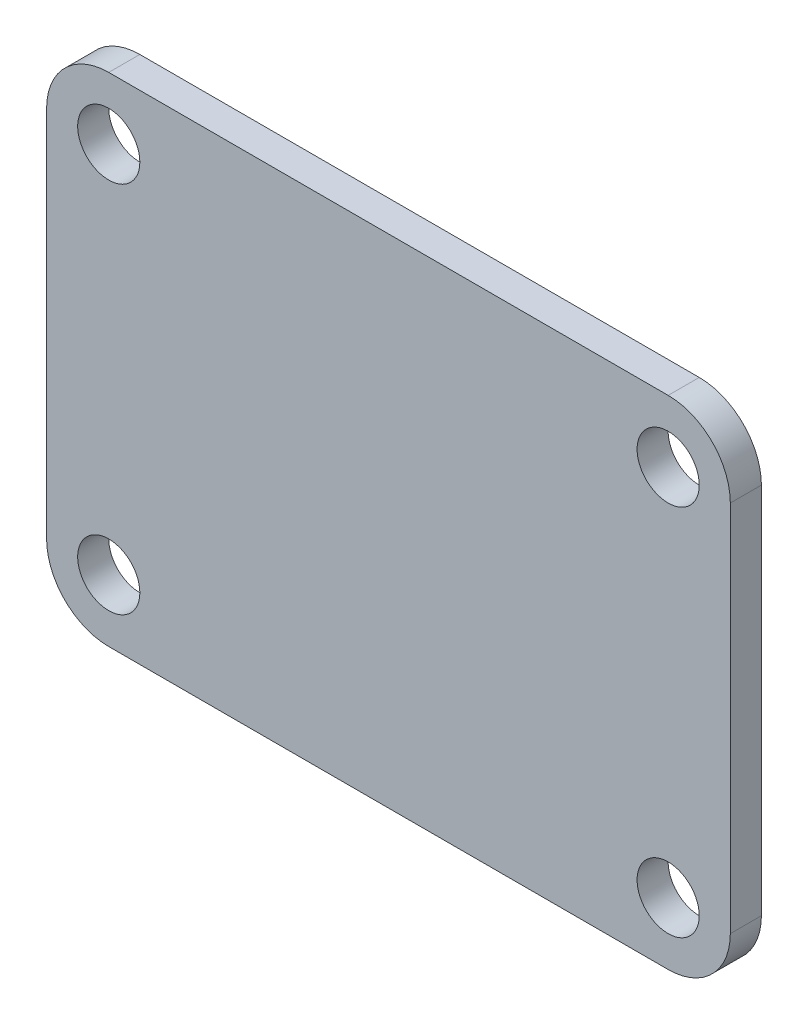
ISO-10303-21;
HEADER;
FILE_DESCRIPTION(('STEP AP214'),'2;1');
FILE_NAME('part.step','',(''),(''),'','','');
FILE_SCHEMA(('AUTOMOTIVE_DESIGN { 1 0 10303 214 1 1 1 1 }'));
ENDSEC;
DATA;
#1=APPLICATION_CONTEXT('core data for automotive mechanical design processes');
#2=APPLICATION_PROTOCOL_DEFINITION('international standard','automotive_design',2000,#1);
#3=PRODUCT_CONTEXT('',#1,'mechanical');
#4=PRODUCT('Part','Part','',(#3));
#5=PRODUCT_RELATED_PRODUCT_CATEGORY('part','',(#4));
#6=PRODUCT_DEFINITION_FORMATION('','',#4);
#7=PRODUCT_DEFINITION_CONTEXT('part definition',#1,'design');
#8=PRODUCT_DEFINITION('design','',#6,#7);
#9=PRODUCT_DEFINITION_SHAPE('','',#8);
#10=(LENGTH_UNIT() NAMED_UNIT(*) SI_UNIT(.MILLI.,.METRE.));
#11=(NAMED_UNIT(*) PLANE_ANGLE_UNIT() SI_UNIT($,.RADIAN.));
#12=(NAMED_UNIT(*) SI_UNIT($,.STERADIAN.) SOLID_ANGLE_UNIT());
#13=UNCERTAINTY_MEASURE_WITH_UNIT(LENGTH_MEASURE(1.E-05),#10,'distance_accuracy_value','');
#14=(GEOMETRIC_REPRESENTATION_CONTEXT(3) GLOBAL_UNCERTAINTY_ASSIGNED_CONTEXT((#13)) GLOBAL_UNIT_ASSIGNED_CONTEXT((#10,
#11,#12)) REPRESENTATION_CONTEXT('',''));
#15=CARTESIAN_POINT('',(0.,0.,0.));
#16=DIRECTION('',(0.,0.,1.));
#17=DIRECTION('',(1.,0.,0.));
#18=AXIS2_PLACEMENT_3D('',#15,#16,#17);
#19=CARTESIAN_POINT('',(0.,0.,1.27));
#20=DIRECTION('',(0.,0.,1.));
#21=DIRECTION('',(1.,0.,0.));
#22=AXIS2_PLACEMENT_3D('',#19,#20,#21);
#23=PLANE('',#22);
#24=CARTESIAN_POINT('',(0.,15.24,1.27));
#25=DIRECTION('',(0.,0.,1.));
#26=DIRECTION('',(1.,0.,0.));
#27=AXIS2_PLACEMENT_3D('',#24,#25,#26);
#28=CIRCLE('',#27,1.27);
#29=CARTESIAN_POINT('',(1.27,15.24,1.27));
#30=VERTEX_POINT('',#29);
#31=EDGE_CURVE('E220',#30,#30,#28,.T.);
#32=ORIENTED_EDGE('',*,*,#31,.F.);
#33=EDGE_LOOP('',(#32));
#34=FACE_BOUND('',#33,.T.);
#35=CARTESIAN_POINT('',(0.,0.,1.27));
#36=DIRECTION('',(0.,0.,1.));
#37=DIRECTION('',(1.,0.,0.));
#38=AXIS2_PLACEMENT_3D('',#35,#36,#37);
#39=CIRCLE('',#38,1.27);
#40=CARTESIAN_POINT('',(1.27,0.,1.27));
#41=VERTEX_POINT('',#40);
#42=EDGE_CURVE('E200',#41,#41,#39,.T.);
#43=ORIENTED_EDGE('',*,*,#42,.F.);
#44=EDGE_LOOP('',(#43));
#45=FACE_BOUND('',#44,.T.);
#46=DIRECTION('',(0.,-1.,0.));
#47=VECTOR('',#46,1.);
#48=CARTESIAN_POINT('',(-2.54,17.78,1.27));
#49=LINE('',#48,#47);
#50=CARTESIAN_POINT('',(-2.54,15.24,1.27));
#51=VERTEX_POINT('',#50);
#52=CARTESIAN_POINT('',(-2.54,0.,1.27));
#53=VERTEX_POINT('',#52);
#54=EDGE_CURVE('E194',#51,#53,#49,.T.);
#55=ORIENTED_EDGE('',*,*,#54,.T.);
#56=CARTESIAN_POINT('',(0.,0.,1.27));
#57=DIRECTION('',(0.,0.,1.));
#58=DIRECTION('',(1.,0.,0.));
#59=AXIS2_PLACEMENT_3D('',#56,#57,#58);
#60=CIRCLE('',#59,2.54);
#61=CARTESIAN_POINT('',(0.,-2.54,1.27));
#62=VERTEX_POINT('',#61);
#63=EDGE_CURVE('E170',#53,#62,#60,.T.);
#64=ORIENTED_EDGE('',*,*,#63,.T.);
#65=DIRECTION('',(1.,0.,0.));
#66=VECTOR('',#65,1.);
#67=CARTESIAN_POINT('',(-2.54,-2.54,1.27));
#68=LINE('',#67,#66);
#69=CARTESIAN_POINT('',(22.86,-2.54,1.27));
#70=VERTEX_POINT('',#69);
#71=EDGE_CURVE('E127',#62,#70,#68,.T.);
#72=ORIENTED_EDGE('',*,*,#71,.T.);
#73=CARTESIAN_POINT('',(22.86,0.,1.27));
#74=DIRECTION('',(0.,0.,1.));
#75=DIRECTION('',(1.,0.,0.));
#76=AXIS2_PLACEMENT_3D('',#73,#74,#75);
#77=CIRCLE('',#76,2.54);
#78=CARTESIAN_POINT('',(25.4,0.,1.27));
#79=VERTEX_POINT('',#78);
#80=EDGE_CURVE('E62',#70,#79,#77,.T.);
#81=ORIENTED_EDGE('',*,*,#80,.T.);
#82=DIRECTION('',(0.,1.,0.));
#83=VECTOR('',#82,1.);
#84=CARTESIAN_POINT('',(25.4,-2.54,1.27));
#85=LINE('',#84,#83);
#86=CARTESIAN_POINT('',(25.4,15.24,1.27));
#87=VERTEX_POINT('',#86);
#88=EDGE_CURVE('E148',#79,#87,#85,.T.);
#89=ORIENTED_EDGE('',*,*,#88,.T.);
#90=CARTESIAN_POINT('',(22.86,15.24,1.27));
#91=DIRECTION('',(0.,0.,1.));
#92=DIRECTION('',(1.,0.,0.));
#93=AXIS2_PLACEMENT_3D('',#90,#91,#92);
#94=CIRCLE('',#93,2.54);
#95=CARTESIAN_POINT('',(22.86,17.78,1.27));
#96=VERTEX_POINT('',#95);
#97=EDGE_CURVE('E165',#87,#96,#94,.T.);
#98=ORIENTED_EDGE('',*,*,#97,.T.);
#99=DIRECTION('',(-1.,0.,0.));
#100=VECTOR('',#99,1.);
#101=CARTESIAN_POINT('',(25.4,17.78,1.27));
#102=LINE('',#101,#100);
#103=CARTESIAN_POINT('',(0.,17.78,1.27));
#104=VERTEX_POINT('',#103);
#105=EDGE_CURVE('E141',#96,#104,#102,.T.);
#106=ORIENTED_EDGE('',*,*,#105,.T.);
#107=CARTESIAN_POINT('',(0.,15.24,1.27));
#108=DIRECTION('',(0.,0.,1.));
#109=DIRECTION('',(1.,0.,0.));
#110=AXIS2_PLACEMENT_3D('',#107,#108,#109);
#111=CIRCLE('',#110,2.54);
#112=EDGE_CURVE('E162',#104,#51,#111,.T.);
#113=ORIENTED_EDGE('',*,*,#112,.T.);
#114=EDGE_LOOP('',(#55,#64,#72,#81,#89,#98,#106,#113));
#115=FACE_BOUND('',#114,.T.);
#116=CARTESIAN_POINT('',(22.86,15.24,1.27));
#117=DIRECTION('',(0.,0.,1.));
#118=DIRECTION('',(1.,0.,0.));
#119=AXIS2_PLACEMENT_3D('',#116,#117,#118);
#120=CIRCLE('',#119,1.27);
#121=CARTESIAN_POINT('',(24.13,15.24,1.27));
#122=VERTEX_POINT('',#121);
#123=EDGE_CURVE('E214',#122,#122,#120,.T.);
#124=ORIENTED_EDGE('',*,*,#123,.F.);
#125=EDGE_LOOP('',(#124));
#126=FACE_BOUND('',#125,.T.);
#127=CARTESIAN_POINT('',(22.86,0.,1.27));
#128=DIRECTION('',(0.,0.,1.));
#129=DIRECTION('',(1.,0.,0.));
#130=AXIS2_PLACEMENT_3D('',#127,#128,#129);
#131=CIRCLE('',#130,1.27);
#132=CARTESIAN_POINT('',(24.13,0.,1.27));
#133=VERTEX_POINT('',#132);
#134=EDGE_CURVE('E228',#133,#133,#131,.T.);
#135=ORIENTED_EDGE('',*,*,#134,.F.);
#136=EDGE_LOOP('',(#135));
#137=FACE_BOUND('',#136,.T.);
#138=ADVANCED_FACE('F39',(#34,#45,#115,#126,#137),#23,.T.);
#139=CARTESIAN_POINT('',(0.,0.,0.));
#140=DIRECTION('',(0.,0.,1.));
#141=DIRECTION('',(1.,0.,0.));
#142=AXIS2_PLACEMENT_3D('',#139,#140,#141);
#143=PLANE('',#142);
#144=DIRECTION('',(1.,0.,0.));
#145=VECTOR('',#144,1.);
#146=CARTESIAN_POINT('',(-2.54,-2.54,0.));
#147=LINE('',#146,#145);
#148=CARTESIAN_POINT('',(0.,-2.54,0.));
#149=VERTEX_POINT('',#148);
#150=CARTESIAN_POINT('',(22.86,-2.54,0.));
#151=VERTEX_POINT('',#150);
#152=EDGE_CURVE('E125',#149,#151,#147,.T.);
#153=ORIENTED_EDGE('',*,*,#152,.F.);
#154=CARTESIAN_POINT('',(0.,0.,0.));
#155=DIRECTION('',(0.,0.,1.));
#156=DIRECTION('',(1.,0.,0.));
#157=AXIS2_PLACEMENT_3D('',#154,#155,#156);
#158=CIRCLE('',#157,2.54);
#159=CARTESIAN_POINT('',(-2.54,0.,0.));
#160=VERTEX_POINT('',#159);
#161=EDGE_CURVE('E107',#149,#160,#158,.F.);
#162=ORIENTED_EDGE('',*,*,#161,.T.);
#163=DIRECTION('',(0.,-1.,0.));
#164=VECTOR('',#163,1.);
#165=CARTESIAN_POINT('',(-2.54,17.78,0.));
#166=LINE('',#165,#164);
#167=CARTESIAN_POINT('',(-2.54,15.24,0.));
#168=VERTEX_POINT('',#167);
#169=EDGE_CURVE('E137',#168,#160,#166,.T.);
#170=ORIENTED_EDGE('',*,*,#169,.F.);
#171=CARTESIAN_POINT('',(0.,15.24,0.));
#172=DIRECTION('',(0.,0.,1.));
#173=DIRECTION('',(1.,0.,0.));
#174=AXIS2_PLACEMENT_3D('',#171,#172,#173);
#175=CIRCLE('',#174,2.54);
#176=CARTESIAN_POINT('',(0.,17.78,0.));
#177=VERTEX_POINT('',#176);
#178=EDGE_CURVE('E129',#168,#177,#175,.F.);
#179=ORIENTED_EDGE('',*,*,#178,.T.);
#180=DIRECTION('',(-1.,0.,0.));
#181=VECTOR('',#180,1.);
#182=CARTESIAN_POINT('',(25.4,17.78,0.));
#183=LINE('',#182,#181);
#184=CARTESIAN_POINT('',(22.86,17.78,0.));
#185=VERTEX_POINT('',#184);
#186=EDGE_CURVE('E143',#185,#177,#183,.T.);
#187=ORIENTED_EDGE('',*,*,#186,.F.);
#188=CARTESIAN_POINT('',(22.86,15.24,0.));
#189=DIRECTION('',(0.,0.,1.));
#190=DIRECTION('',(1.,0.,0.));
#191=AXIS2_PLACEMENT_3D('',#188,#189,#190);
#192=CIRCLE('',#191,2.54);
#193=CARTESIAN_POINT('',(25.4,15.24,0.));
#194=VERTEX_POINT('',#193);
#195=EDGE_CURVE('E152',#185,#194,#192,.F.);
#196=ORIENTED_EDGE('',*,*,#195,.T.);
#197=DIRECTION('',(0.,1.,0.));
#198=VECTOR('',#197,1.);
#199=CARTESIAN_POINT('',(25.4,-2.54,0.));
#200=LINE('',#199,#198);
#201=CARTESIAN_POINT('',(25.4,0.,0.));
#202=VERTEX_POINT('',#201);
#203=EDGE_CURVE('E136',#202,#194,#200,.T.);
#204=ORIENTED_EDGE('',*,*,#203,.F.);
#205=CARTESIAN_POINT('',(22.86,0.,0.));
#206=DIRECTION('',(0.,0.,1.));
#207=DIRECTION('',(1.,0.,0.));
#208=AXIS2_PLACEMENT_3D('',#205,#206,#207);
#209=CIRCLE('',#208,2.54);
#210=EDGE_CURVE('E119',#202,#151,#209,.F.);
#211=ORIENTED_EDGE('',*,*,#210,.T.);
#212=EDGE_LOOP('',(#153,#162,#170,#179,#187,#196,#204,#211));
#213=FACE_BOUND('',#212,.T.);
#214=CARTESIAN_POINT('',(0.,0.,0.));
#215=DIRECTION('',(0.,0.,1.));
#216=DIRECTION('',(1.,0.,0.));
#217=AXIS2_PLACEMENT_3D('',#214,#215,#216);
#218=CIRCLE('',#217,1.27);
#219=CARTESIAN_POINT('',(1.27,0.,0.));
#220=VERTEX_POINT('',#219);
#221=EDGE_CURVE('E203',#220,#220,#218,.T.);
#222=ORIENTED_EDGE('',*,*,#221,.T.);
#223=EDGE_LOOP('',(#222));
#224=FACE_BOUND('',#223,.T.);
#225=CARTESIAN_POINT('',(22.86,15.24,0.));
#226=DIRECTION('',(0.,0.,1.));
#227=DIRECTION('',(1.,0.,0.));
#228=AXIS2_PLACEMENT_3D('',#225,#226,#227);
#229=CIRCLE('',#228,1.27);
#230=CARTESIAN_POINT('',(24.13,15.24,0.));
#231=VERTEX_POINT('',#230);
#232=EDGE_CURVE('E216',#231,#231,#229,.T.);
#233=ORIENTED_EDGE('',*,*,#232,.T.);
#234=EDGE_LOOP('',(#233));
#235=FACE_BOUND('',#234,.T.);
#236=CARTESIAN_POINT('',(0.,15.24,0.));
#237=DIRECTION('',(0.,0.,1.));
#238=DIRECTION('',(1.,0.,0.));
#239=AXIS2_PLACEMENT_3D('',#236,#237,#238);
#240=CIRCLE('',#239,1.27);
#241=CARTESIAN_POINT('',(1.27,15.24,0.));
#242=VERTEX_POINT('',#241);
#243=EDGE_CURVE('E224',#242,#242,#240,.T.);
#244=ORIENTED_EDGE('',*,*,#243,.T.);
#245=EDGE_LOOP('',(#244));
#246=FACE_BOUND('',#245,.T.);
#247=CARTESIAN_POINT('',(22.86,0.,0.));
#248=DIRECTION('',(0.,0.,1.));
#249=DIRECTION('',(1.,0.,0.));
#250=AXIS2_PLACEMENT_3D('',#247,#248,#249);
#251=CIRCLE('',#250,1.27);
#252=CARTESIAN_POINT('',(24.13,0.,0.));
#253=VERTEX_POINT('',#252);
#254=EDGE_CURVE('E232',#253,#253,#251,.T.);
#255=ORIENTED_EDGE('',*,*,#254,.T.);
#256=EDGE_LOOP('',(#255));
#257=FACE_BOUND('',#256,.T.);
#258=ADVANCED_FACE('F132',(#213,#224,#235,#246,#257),#143,.F.);
#259=CARTESIAN_POINT('',(25.4,17.78,1.27));
#260=DIRECTION('',(0.,-1.,0.));
#261=DIRECTION('',(0.,0.,-1.));
#262=AXIS2_PLACEMENT_3D('',#259,#260,#261);
#263=PLANE('',#262);
#264=ORIENTED_EDGE('',*,*,#105,.F.);
#265=DIRECTION('',(0.,0.,-1.));
#266=VECTOR('',#265,1.);
#267=CARTESIAN_POINT('',(22.86,17.78,1.27));
#268=LINE('',#267,#266);
#269=EDGE_CURVE('E11',#96,#185,#268,.T.);
#270=ORIENTED_EDGE('',*,*,#269,.T.);
#271=ORIENTED_EDGE('',*,*,#186,.T.);
#272=DIRECTION('',(0.,0.,-1.));
#273=VECTOR('',#272,1.);
#274=CARTESIAN_POINT('',(0.,17.78,1.27));
#275=LINE('',#274,#273);
#276=EDGE_CURVE('E48',#177,#104,#275,.F.);
#277=ORIENTED_EDGE('',*,*,#276,.T.);
#278=EDGE_LOOP('',(#264,#270,#271,#277));
#279=FACE_BOUND('',#278,.T.);
#280=ADVANCED_FACE('F184',(#279),#263,.F.);
#281=CARTESIAN_POINT('',(-2.54,17.78,1.27));
#282=DIRECTION('',(1.,0.,0.));
#283=DIRECTION('',(0.,0.,-1.));
#284=AXIS2_PLACEMENT_3D('',#281,#282,#283);
#285=PLANE('',#284);
#286=ORIENTED_EDGE('',*,*,#169,.T.);
#287=DIRECTION('',(0.,0.,-1.));
#288=VECTOR('',#287,1.);
#289=CARTESIAN_POINT('',(-2.54,0.,1.27));
#290=LINE('',#289,#288);
#291=EDGE_CURVE('E112',#160,#53,#290,.F.);
#292=ORIENTED_EDGE('',*,*,#291,.T.);
#293=ORIENTED_EDGE('',*,*,#54,.F.);
#294=DIRECTION('',(0.,0.,-1.));
#295=VECTOR('',#294,1.);
#296=CARTESIAN_POINT('',(-2.54,15.24,1.27));
#297=LINE('',#296,#295);
#298=EDGE_CURVE('E118',#51,#168,#297,.T.);
#299=ORIENTED_EDGE('',*,*,#298,.T.);
#300=EDGE_LOOP('',(#286,#292,#293,#299));
#301=FACE_BOUND('',#300,.T.);
#302=ADVANCED_FACE('F198',(#301),#285,.F.);
#303=CARTESIAN_POINT('',(-2.54,-2.54,1.27));
#304=DIRECTION('',(0.,1.,0.));
#305=DIRECTION('',(0.,0.,1.));
#306=AXIS2_PLACEMENT_3D('',#303,#304,#305);
#307=PLANE('',#306);
#308=ORIENTED_EDGE('',*,*,#71,.F.);
#309=DIRECTION('',(0.,0.,-1.));
#310=VECTOR('',#309,1.);
#311=CARTESIAN_POINT('',(0.,-2.54,1.27));
#312=LINE('',#311,#310);
#313=EDGE_CURVE('E111',#62,#149,#312,.T.);
#314=ORIENTED_EDGE('',*,*,#313,.T.);
#315=ORIENTED_EDGE('',*,*,#152,.T.);
#316=DIRECTION('',(0.,0.,-1.));
#317=VECTOR('',#316,1.);
#318=CARTESIAN_POINT('',(22.86,-2.54,1.27));
#319=LINE('',#318,#317);
#320=EDGE_CURVE('E130',#151,#70,#319,.F.);
#321=ORIENTED_EDGE('',*,*,#320,.T.);
#322=EDGE_LOOP('',(#308,#314,#315,#321));
#323=FACE_BOUND('',#322,.T.);
#324=ADVANCED_FACE('F124',(#323),#307,.F.);
#325=CARTESIAN_POINT('',(25.4,-2.54,1.27));
#326=DIRECTION('',(-1.,0.,0.));
#327=DIRECTION('',(0.,0.,1.));
#328=AXIS2_PLACEMENT_3D('',#325,#326,#327);
#329=PLANE('',#328);
#330=ORIENTED_EDGE('',*,*,#88,.F.);
#331=DIRECTION('',(0.,0.,-1.));
#332=VECTOR('',#331,1.);
#333=CARTESIAN_POINT('',(25.4,0.,1.27));
#334=LINE('',#333,#332);
#335=EDGE_CURVE('E175',#79,#202,#334,.T.);
#336=ORIENTED_EDGE('',*,*,#335,.T.);
#337=ORIENTED_EDGE('',*,*,#203,.T.);
#338=DIRECTION('',(0.,0.,-1.));
#339=VECTOR('',#338,1.);
#340=CARTESIAN_POINT('',(25.4,15.24,1.27));
#341=LINE('',#340,#339);
#342=EDGE_CURVE('E55',#194,#87,#341,.F.);
#343=ORIENTED_EDGE('',*,*,#342,.T.);
#344=EDGE_LOOP('',(#330,#336,#337,#343));
#345=FACE_BOUND('',#344,.T.);
#346=ADVANCED_FACE('F256',(#345),#329,.F.);
#347=CARTESIAN_POINT('',(0.,0.,1.27));
#348=DIRECTION('',(0.,0.,-1.));
#349=DIRECTION('',(-1.,0.,0.));
#350=AXIS2_PLACEMENT_3D('',#347,#348,#349);
#351=CYLINDRICAL_SURFACE('',#350,1.27);
#352=ORIENTED_EDGE('',*,*,#42,.T.);
#353=EDGE_LOOP('',(#352));
#354=FACE_BOUND('',#353,.T.);
#355=ORIENTED_EDGE('',*,*,#221,.F.);
#356=EDGE_LOOP('',(#355));
#357=FACE_BOUND('',#356,.T.);
#358=ADVANCED_FACE('F253',(#354,#357),#351,.F.);
#359=CARTESIAN_POINT('',(22.86,15.24,1.27));
#360=DIRECTION('',(0.,0.,-1.));
#361=DIRECTION('',(-1.,0.,0.));
#362=AXIS2_PLACEMENT_3D('',#359,#360,#361);
#363=CYLINDRICAL_SURFACE('',#362,1.27);
#364=ORIENTED_EDGE('',*,*,#123,.T.);
#365=EDGE_LOOP('',(#364));
#366=FACE_BOUND('',#365,.T.);
#367=ORIENTED_EDGE('',*,*,#232,.F.);
#368=EDGE_LOOP('',(#367));
#369=FACE_BOUND('',#368,.T.);
#370=ADVANCED_FACE('F348',(#366,#369),#363,.F.);
#371=CARTESIAN_POINT('',(0.,15.24,1.27));
#372=DIRECTION('',(0.,0.,-1.));
#373=DIRECTION('',(-1.,0.,0.));
#374=AXIS2_PLACEMENT_3D('',#371,#372,#373);
#375=CYLINDRICAL_SURFACE('',#374,1.27);
#376=ORIENTED_EDGE('',*,*,#31,.T.);
#377=EDGE_LOOP('',(#376));
#378=FACE_BOUND('',#377,.T.);
#379=ORIENTED_EDGE('',*,*,#243,.F.);
#380=EDGE_LOOP('',(#379));
#381=FACE_BOUND('',#380,.T.);
#382=ADVANCED_FACE('F339',(#378,#381),#375,.F.);
#383=CARTESIAN_POINT('',(22.86,0.,1.27));
#384=DIRECTION('',(0.,0.,-1.));
#385=DIRECTION('',(-1.,0.,0.));
#386=AXIS2_PLACEMENT_3D('',#383,#384,#385);
#387=CYLINDRICAL_SURFACE('',#386,1.27);
#388=ORIENTED_EDGE('',*,*,#134,.T.);
#389=EDGE_LOOP('',(#388));
#390=FACE_BOUND('',#389,.T.);
#391=ORIENTED_EDGE('',*,*,#254,.F.);
#392=EDGE_LOOP('',(#391));
#393=FACE_BOUND('',#392,.T.);
#394=ADVANCED_FACE('F240',(#390,#393),#387,.F.);
#395=CARTESIAN_POINT('',(0.,0.,1.27));
#396=DIRECTION('',(0.,0.,-1.));
#397=DIRECTION('',(-1.,0.,0.));
#398=AXIS2_PLACEMENT_3D('',#395,#396,#397);
#399=CYLINDRICAL_SURFACE('',#398,2.54);
#400=ORIENTED_EDGE('',*,*,#63,.F.);
#401=ORIENTED_EDGE('',*,*,#291,.F.);
#402=ORIENTED_EDGE('',*,*,#161,.F.);
#403=ORIENTED_EDGE('',*,*,#313,.F.);
#404=EDGE_LOOP('',(#400,#401,#402,#403));
#405=FACE_BOUND('',#404,.T.);
#406=ADVANCED_FACE('F110',(#405),#399,.T.);
#407=CARTESIAN_POINT('',(22.86,0.,1.27));
#408=DIRECTION('',(0.,0.,-1.));
#409=DIRECTION('',(-1.,0.,0.));
#410=AXIS2_PLACEMENT_3D('',#407,#408,#409);
#411=CYLINDRICAL_SURFACE('',#410,2.54);
#412=ORIENTED_EDGE('',*,*,#80,.F.);
#413=ORIENTED_EDGE('',*,*,#320,.F.);
#414=ORIENTED_EDGE('',*,*,#210,.F.);
#415=ORIENTED_EDGE('',*,*,#335,.F.);
#416=EDGE_LOOP('',(#412,#413,#414,#415));
#417=FACE_BOUND('',#416,.T.);
#418=ADVANCED_FACE('F267',(#417),#411,.T.);
#419=CARTESIAN_POINT('',(22.86,15.24,1.27));
#420=DIRECTION('',(0.,0.,-1.));
#421=DIRECTION('',(-1.,0.,0.));
#422=AXIS2_PLACEMENT_3D('',#419,#420,#421);
#423=CYLINDRICAL_SURFACE('',#422,2.54);
#424=ORIENTED_EDGE('',*,*,#97,.F.);
#425=ORIENTED_EDGE('',*,*,#342,.F.);
#426=ORIENTED_EDGE('',*,*,#195,.F.);
#427=ORIENTED_EDGE('',*,*,#269,.F.);
#428=EDGE_LOOP('',(#424,#425,#426,#427));
#429=FACE_BOUND('',#428,.T.);
#430=ADVANCED_FACE('F269',(#429),#423,.T.);
#431=CARTESIAN_POINT('',(0.,15.24,1.27));
#432=DIRECTION('',(0.,0.,-1.));
#433=DIRECTION('',(-1.,0.,0.));
#434=AXIS2_PLACEMENT_3D('',#431,#432,#433);
#435=CYLINDRICAL_SURFACE('',#434,2.54);
#436=ORIENTED_EDGE('',*,*,#112,.F.);
#437=ORIENTED_EDGE('',*,*,#276,.F.);
#438=ORIENTED_EDGE('',*,*,#178,.F.);
#439=ORIENTED_EDGE('',*,*,#298,.F.);
#440=EDGE_LOOP('',(#436,#437,#438,#439));
#441=FACE_BOUND('',#440,.T.);
#442=ADVANCED_FACE('F41',(#441),#435,.T.);
#443=CLOSED_SHELL('',(#138,#258,#280,#302,#324,#346,#358,#370,#382,#394,#406,#418,#430,#442));
#444=MANIFOLD_SOLID_BREP('B2',#443);
#445=ADVANCED_BREP_SHAPE_REPRESENTATION('',(#18,#444),#14);
#446=SHAPE_DEFINITION_REPRESENTATION(#9,#445);
ENDSEC;
END-ISO-10303-21;
